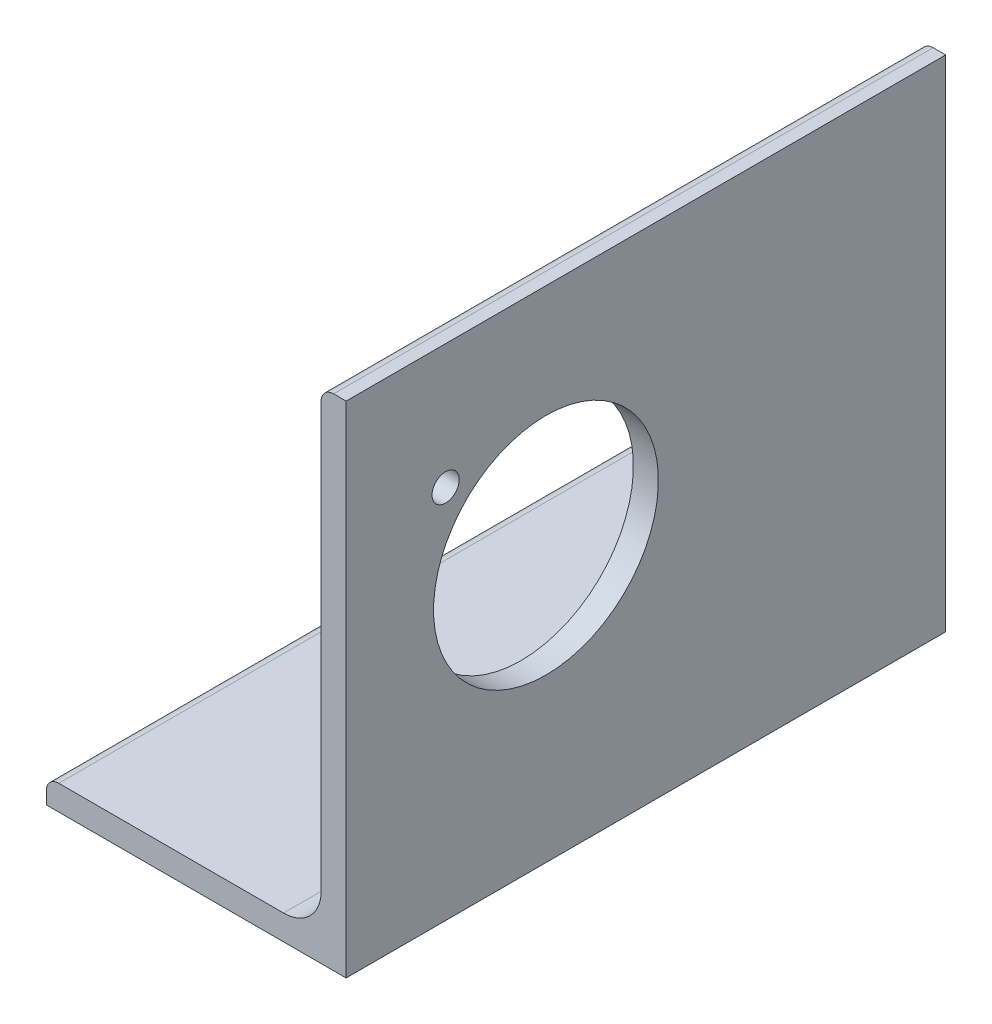
ISO-10303-21;
HEADER;
FILE_DESCRIPTION(('STEP AP214'),'2;1');
FILE_NAME('part.step','',(''),(''),'','','');
FILE_SCHEMA(('AUTOMOTIVE_DESIGN { 1 0 10303 214 1 1 1 1 }'));
ENDSEC;
DATA;
#1=APPLICATION_CONTEXT('core data for automotive mechanical design processes');
#2=APPLICATION_PROTOCOL_DEFINITION('international standard','automotive_design',2000,#1);
#3=PRODUCT_CONTEXT('',#1,'mechanical');
#4=PRODUCT('Part','Part','',(#3));
#5=PRODUCT_RELATED_PRODUCT_CATEGORY('part','',(#4));
#6=PRODUCT_DEFINITION_FORMATION('','',#4);
#7=PRODUCT_DEFINITION_CONTEXT('part definition',#1,'design');
#8=PRODUCT_DEFINITION('design','',#6,#7);
#9=PRODUCT_DEFINITION_SHAPE('','',#8);
#10=(LENGTH_UNIT() NAMED_UNIT(*) SI_UNIT(.MILLI.,.METRE.));
#11=(NAMED_UNIT(*) PLANE_ANGLE_UNIT() SI_UNIT($,.RADIAN.));
#12=(NAMED_UNIT(*) SI_UNIT($,.STERADIAN.) SOLID_ANGLE_UNIT());
#13=UNCERTAINTY_MEASURE_WITH_UNIT(LENGTH_MEASURE(1.E-05),#10,'distance_accuracy_value','');
#14=(GEOMETRIC_REPRESENTATION_CONTEXT(3) GLOBAL_UNCERTAINTY_ASSIGNED_CONTEXT((#13)) GLOBAL_UNIT_ASSIGNED_CONTEXT((#10,
#11,#12)) REPRESENTATION_CONTEXT('',''));
#15=CARTESIAN_POINT('',(0.,0.,0.));
#16=DIRECTION('',(0.,0.,1.));
#17=DIRECTION('',(1.,0.,0.));
#18=AXIS2_PLACEMENT_3D('',#15,#16,#17);
#19=CARTESIAN_POINT('',(-19.05,-30.1625,38.1));
#20=DIRECTION('',(1.,0.,0.));
#21=DIRECTION('',(0.,0.,-1.));
#22=AXIS2_PLACEMENT_3D('',#19,#20,#21);
#23=PLANE('',#22);
#24=DIRECTION('',(0.,-1.,0.));
#25=VECTOR('',#24,1.);
#26=CARTESIAN_POINT('',(-19.05,-30.1625,-38.1));
#27=LINE('',#26,#25);
#28=CARTESIAN_POINT('',(-19.05,-30.1625,-38.1));
#29=VERTEX_POINT('',#28);
#30=CARTESIAN_POINT('',(-19.05,-31.75,-38.1));
#31=VERTEX_POINT('',#30);
#32=EDGE_CURVE('E147',#29,#31,#27,.T.);
#33=ORIENTED_EDGE('',*,*,#32,.T.);
#34=DIRECTION('',(0.,0.,-1.));
#35=VECTOR('',#34,1.);
#36=CARTESIAN_POINT('',(-19.05,-31.75,38.1));
#37=LINE('',#36,#35);
#38=CARTESIAN_POINT('',(-19.05,-31.75,38.1));
#39=VERTEX_POINT('',#38);
#40=EDGE_CURVE('E11',#39,#31,#37,.T.);
#41=ORIENTED_EDGE('',*,*,#40,.F.);
#42=DIRECTION('',(0.,-1.,0.));
#43=VECTOR('',#42,1.);
#44=CARTESIAN_POINT('',(-19.05,-30.1625,38.1));
#45=LINE('',#44,#43);
#46=CARTESIAN_POINT('',(-19.05,-30.1625,38.1));
#47=VERTEX_POINT('',#46);
#48=EDGE_CURVE('E164',#47,#39,#45,.T.);
#49=ORIENTED_EDGE('',*,*,#48,.F.);
#50=DIRECTION('',(0.,0.,-1.));
#51=VECTOR('',#50,1.);
#52=CARTESIAN_POINT('',(-19.05,-30.1625,38.1));
#53=LINE('',#52,#51);
#54=EDGE_CURVE('E143',#47,#29,#53,.T.);
#55=ORIENTED_EDGE('',*,*,#54,.T.);
#56=EDGE_LOOP('',(#33,#41,#49,#55));
#57=FACE_BOUND('',#56,.T.);
#58=ADVANCED_FACE('F43',(#57),#23,.F.);
#59=CARTESIAN_POINT('',(-19.05,-31.75,38.1));
#60=DIRECTION('',(0.,1.,0.));
#61=DIRECTION('',(-1.,0.,0.));
#62=AXIS2_PLACEMENT_3D('',#59,#60,#61);
#63=PLANE('',#62);
#64=CARTESIAN_POINT('',(0.,-31.75,0.));
#65=DIRECTION('',(0.,-1.,0.));
#66=DIRECTION('',(1.,0.,0.));
#67=AXIS2_PLACEMENT_3D('',#64,#65,#66);
#68=CIRCLE('',#67,2.4892);
#69=CARTESIAN_POINT('',(2.4892,-31.75,0.));
#70=VERTEX_POINT('',#69);
#71=EDGE_CURVE('E180',#70,#70,#68,.T.);
#72=ORIENTED_EDGE('',*,*,#71,.F.);
#73=EDGE_LOOP('',(#72));
#74=FACE_BOUND('',#73,.T.);
#75=CARTESIAN_POINT('',(0.,-31.75,-25.4));
#76=DIRECTION('',(0.,-1.,0.));
#77=DIRECTION('',(1.,0.,0.));
#78=AXIS2_PLACEMENT_3D('',#75,#76,#77);
#79=CIRCLE('',#78,2.4892);
#80=CARTESIAN_POINT('',(2.4892,-31.75,-25.4));
#81=VERTEX_POINT('',#80);
#82=EDGE_CURVE('E186',#81,#81,#79,.T.);
#83=ORIENTED_EDGE('',*,*,#82,.F.);
#84=EDGE_LOOP('',(#83));
#85=FACE_BOUND('',#84,.T.);
#86=DIRECTION('',(1.,0.,0.));
#87=VECTOR('',#86,1.);
#88=CARTESIAN_POINT('',(-19.05,-31.75,-38.1));
#89=LINE('',#88,#87);
#90=CARTESIAN_POINT('',(19.05,-31.75,-38.1));
#91=VERTEX_POINT('',#90);
#92=EDGE_CURVE('E150',#31,#91,#89,.T.);
#93=ORIENTED_EDGE('',*,*,#92,.T.);
#94=DIRECTION('',(0.,0.,-1.));
#95=VECTOR('',#94,1.);
#96=CARTESIAN_POINT('',(19.05,-31.75,38.1));
#97=LINE('',#96,#95);
#98=CARTESIAN_POINT('',(19.05,-31.75,38.1));
#99=VERTEX_POINT('',#98);
#100=EDGE_CURVE('E52',#99,#91,#97,.T.);
#101=ORIENTED_EDGE('',*,*,#100,.F.);
#102=DIRECTION('',(1.,0.,0.));
#103=VECTOR('',#102,1.);
#104=CARTESIAN_POINT('',(-19.05,-31.75,38.1));
#105=LINE('',#104,#103);
#106=EDGE_CURVE('E107',#39,#99,#105,.T.);
#107=ORIENTED_EDGE('',*,*,#106,.F.);
#108=ORIENTED_EDGE('',*,*,#40,.T.);
#109=EDGE_LOOP('',(#93,#101,#107,#108));
#110=FACE_BOUND('',#109,.T.);
#111=ADVANCED_FACE('F239',(#74,#85,#110),#63,.F.);
#112=CARTESIAN_POINT('',(19.05,-31.75,38.1));
#113=DIRECTION('',(-1.,0.,0.));
#114=DIRECTION('',(0.,-1.,0.));
#115=AXIS2_PLACEMENT_3D('',#112,#113,#114);
#116=PLANE('',#115);
#117=CARTESIAN_POINT('',(19.05,15.9317261919403,25.4519637415276));
#118=DIRECTION('',(-1.,0.,0.));
#119=DIRECTION('',(0.,-1.,0.));
#120=AXIS2_PLACEMENT_3D('',#117,#118,#119);
#121=CIRCLE('',#120,1.7272);
#122=CARTESIAN_POINT('',(19.05,14.2045261919403,25.4519637415276));
#123=VERTEX_POINT('',#122);
#124=EDGE_CURVE('E184',#123,#123,#121,.T.);
#125=ORIENTED_EDGE('',*,*,#124,.T.);
#126=EDGE_LOOP('',(#125));
#127=FACE_BOUND('',#126,.T.);
#128=CARTESIAN_POINT('',(19.05,3.17976250002207,12.7000000496094));
#129=DIRECTION('',(-1.,0.,0.));
#130=DIRECTION('',(0.,-1.,0.));
#131=AXIS2_PLACEMENT_3D('',#128,#129,#130);
#132=CIRCLE('',#131,14.2875);
#133=CARTESIAN_POINT('',(19.05,-11.1077374999779,12.7000000496094));
#134=VERTEX_POINT('',#133);
#135=EDGE_CURVE('E151',#134,#134,#132,.T.);
#136=ORIENTED_EDGE('',*,*,#135,.T.);
#137=EDGE_LOOP('',(#136));
#138=FACE_BOUND('',#137,.T.);
#139=DIRECTION('',(0.,1.,0.));
#140=VECTOR('',#139,1.);
#141=CARTESIAN_POINT('',(19.05,-31.75,-38.1));
#142=LINE('',#141,#140);
#143=CARTESIAN_POINT('',(19.05,31.75,-38.1));
#144=VERTEX_POINT('',#143);
#145=EDGE_CURVE('E153',#91,#144,#142,.T.);
#146=ORIENTED_EDGE('',*,*,#145,.T.);
#147=DIRECTION('',(0.,0.,-1.));
#148=VECTOR('',#147,1.);
#149=CARTESIAN_POINT('',(19.05,31.75,38.1));
#150=LINE('',#149,#148);
#151=CARTESIAN_POINT('',(19.05,31.75,38.1));
#152=VERTEX_POINT('',#151);
#153=EDGE_CURVE('E174',#152,#144,#150,.T.);
#154=ORIENTED_EDGE('',*,*,#153,.F.);
#155=DIRECTION('',(0.,1.,0.));
#156=VECTOR('',#155,1.);
#157=CARTESIAN_POINT('',(19.05,-31.75,38.1));
#158=LINE('',#157,#156);
#159=EDGE_CURVE('E205',#99,#152,#158,.T.);
#160=ORIENTED_EDGE('',*,*,#159,.F.);
#161=ORIENTED_EDGE('',*,*,#100,.T.);
#162=EDGE_LOOP('',(#146,#154,#160,#161));
#163=FACE_BOUND('',#162,.T.);
#164=ADVANCED_FACE('F243',(#127,#138,#163),#116,.F.);
#165=CARTESIAN_POINT('',(17.4625,31.75,38.1));
#166=DIRECTION('',(0.,-1.,0.));
#167=DIRECTION('',(1.,0.,0.));
#168=AXIS2_PLACEMENT_3D('',#165,#166,#167);
#169=PLANE('',#168);
#170=DIRECTION('',(-1.,0.,0.));
#171=VECTOR('',#170,1.);
#172=CARTESIAN_POINT('',(17.4625,31.75,-38.1));
#173=LINE('',#172,#171);
#174=CARTESIAN_POINT('',(17.4625,31.75,-38.1));
#175=VERTEX_POINT('',#174);
#176=EDGE_CURVE('E155',#144,#175,#173,.T.);
#177=ORIENTED_EDGE('',*,*,#176,.T.);
#178=DIRECTION('',(0.,0.,-1.));
#179=VECTOR('',#178,1.);
#180=CARTESIAN_POINT('',(17.4625,31.75,38.1));
#181=LINE('',#180,#179);
#182=CARTESIAN_POINT('',(17.4625,31.75,38.1));
#183=VERTEX_POINT('',#182);
#184=EDGE_CURVE('E171',#183,#175,#181,.T.);
#185=ORIENTED_EDGE('',*,*,#184,.F.);
#186=DIRECTION('',(-1.,0.,0.));
#187=VECTOR('',#186,1.);
#188=CARTESIAN_POINT('',(17.4625,31.75,38.1));
#189=LINE('',#188,#187);
#190=EDGE_CURVE('E207',#152,#183,#189,.T.);
#191=ORIENTED_EDGE('',*,*,#190,.F.);
#192=ORIENTED_EDGE('',*,*,#153,.T.);
#193=EDGE_LOOP('',(#177,#185,#191,#192));
#194=FACE_BOUND('',#193,.T.);
#195=ADVANCED_FACE('F248',(#194),#169,.F.);
#196=CARTESIAN_POINT('',(17.4625,30.1625,38.1));
#197=DIRECTION('',(0.,0.,-1.));
#198=DIRECTION('',(-1.,0.,0.));
#199=AXIS2_PLACEMENT_3D('',#196,#197,#198);
#200=CYLINDRICAL_SURFACE('',#199,1.5875);
#201=CARTESIAN_POINT('',(17.4625,30.1625,-38.1));
#202=DIRECTION('',(0.,0.,1.));
#203=DIRECTION('',(-1.,0.,0.));
#204=AXIS2_PLACEMENT_3D('',#201,#202,#203);
#205=CIRCLE('',#204,1.5875);
#206=CARTESIAN_POINT('',(15.875,30.1625,-38.1));
#207=VERTEX_POINT('',#206);
#208=EDGE_CURVE('E157',#175,#207,#205,.T.);
#209=ORIENTED_EDGE('',*,*,#208,.T.);
#210=DIRECTION('',(0.,0.,-1.));
#211=VECTOR('',#210,1.);
#212=CARTESIAN_POINT('',(15.875,30.1625,38.1));
#213=LINE('',#212,#211);
#214=CARTESIAN_POINT('',(15.875,30.1625,38.1));
#215=VERTEX_POINT('',#214);
#216=EDGE_CURVE('E168',#215,#207,#213,.T.);
#217=ORIENTED_EDGE('',*,*,#216,.F.);
#218=CARTESIAN_POINT('',(17.4625,30.1625,38.1));
#219=DIRECTION('',(0.,0.,1.));
#220=DIRECTION('',(-1.,0.,0.));
#221=AXIS2_PLACEMENT_3D('',#218,#219,#220);
#222=CIRCLE('',#221,1.5875);
#223=EDGE_CURVE('E209',#183,#215,#222,.T.);
#224=ORIENTED_EDGE('',*,*,#223,.F.);
#225=ORIENTED_EDGE('',*,*,#184,.T.);
#226=EDGE_LOOP('',(#209,#217,#224,#225));
#227=FACE_BOUND('',#226,.T.);
#228=ADVANCED_FACE('F215',(#227),#200,.T.);
#229=CARTESIAN_POINT('',(15.875,30.1625,38.1));
#230=DIRECTION('',(1.,0.,0.));
#231=DIRECTION('',(0.,1.,0.));
#232=AXIS2_PLACEMENT_3D('',#229,#230,#231);
#233=PLANE('',#232);
#234=CARTESIAN_POINT('',(15.875,15.9317261919403,25.4519637415276));
#235=DIRECTION('',(-1.,0.,0.));
#236=DIRECTION('',(0.,-1.,0.));
#237=AXIS2_PLACEMENT_3D('',#234,#235,#236);
#238=CIRCLE('',#237,1.7272);
#239=CARTESIAN_POINT('',(15.875,14.2045261919403,25.4519637415276));
#240=VERTEX_POINT('',#239);
#241=EDGE_CURVE('E193',#240,#240,#238,.T.);
#242=ORIENTED_EDGE('',*,*,#241,.F.);
#243=EDGE_LOOP('',(#242));
#244=FACE_BOUND('',#243,.T.);
#245=CARTESIAN_POINT('',(15.875,3.17976250002207,12.7000000496094));
#246=DIRECTION('',(-1.,0.,0.));
#247=DIRECTION('',(0.,-1.,0.));
#248=AXIS2_PLACEMENT_3D('',#245,#246,#247);
#249=CIRCLE('',#248,14.2875);
#250=CARTESIAN_POINT('',(15.875,-11.1077374999779,12.7000000496094));
#251=VERTEX_POINT('',#250);
#252=EDGE_CURVE('E196',#251,#251,#249,.T.);
#253=ORIENTED_EDGE('',*,*,#252,.F.);
#254=EDGE_LOOP('',(#253));
#255=FACE_BOUND('',#254,.T.);
#256=DIRECTION('',(0.,-1.,0.));
#257=VECTOR('',#256,1.);
#258=CARTESIAN_POINT('',(15.875,30.1625,-38.1));
#259=LINE('',#258,#257);
#260=CARTESIAN_POINT('',(15.875,-23.7998,-38.1));
#261=VERTEX_POINT('',#260);
#262=EDGE_CURVE('E159',#207,#261,#259,.T.);
#263=ORIENTED_EDGE('',*,*,#262,.T.);
#264=DIRECTION('',(0.,0.,-1.));
#265=VECTOR('',#264,1.);
#266=CARTESIAN_POINT('',(15.875,-23.7998,38.1));
#267=LINE('',#266,#265);
#268=CARTESIAN_POINT('',(15.875,-23.7998,38.1));
#269=VERTEX_POINT('',#268);
#270=EDGE_CURVE('E138',#269,#261,#267,.T.);
#271=ORIENTED_EDGE('',*,*,#270,.F.);
#272=DIRECTION('',(0.,-1.,0.));
#273=VECTOR('',#272,1.);
#274=CARTESIAN_POINT('',(15.875,30.1625,38.1));
#275=LINE('',#274,#273);
#276=EDGE_CURVE('E129',#215,#269,#275,.T.);
#277=ORIENTED_EDGE('',*,*,#276,.F.);
#278=ORIENTED_EDGE('',*,*,#216,.T.);
#279=EDGE_LOOP('',(#263,#271,#277,#278));
#280=FACE_BOUND('',#279,.T.);
#281=ADVANCED_FACE('F219',(#244,#255,#280),#233,.F.);
#282=CARTESIAN_POINT('',(11.0998,-23.7998,38.1));
#283=DIRECTION('',(0.,0.,-1.));
#284=DIRECTION('',(-1.,0.,0.));
#285=AXIS2_PLACEMENT_3D('',#282,#283,#284);
#286=CYLINDRICAL_SURFACE('',#285,4.7752);
#287=CARTESIAN_POINT('',(11.0998,-23.7998,-38.1));
#288=DIRECTION('',(0.,0.,-1.));
#289=DIRECTION('',(-1.,0.,0.));
#290=AXIS2_PLACEMENT_3D('',#287,#288,#289);
#291=CIRCLE('',#290,4.7752);
#292=CARTESIAN_POINT('',(11.0998,-28.575,-38.1));
#293=VERTEX_POINT('',#292);
#294=EDGE_CURVE('E137',#261,#293,#291,.T.);
#295=ORIENTED_EDGE('',*,*,#294,.T.);
#296=DIRECTION('',(0.,0.,-1.));
#297=VECTOR('',#296,1.);
#298=CARTESIAN_POINT('',(11.0998,-28.575,38.1));
#299=LINE('',#298,#297);
#300=CARTESIAN_POINT('',(11.0998,-28.575,38.1));
#301=VERTEX_POINT('',#300);
#302=EDGE_CURVE('E134',#301,#293,#299,.T.);
#303=ORIENTED_EDGE('',*,*,#302,.F.);
#304=CARTESIAN_POINT('',(11.0998,-23.7998,38.1));
#305=DIRECTION('',(0.,0.,-1.));
#306=DIRECTION('',(-1.,0.,0.));
#307=AXIS2_PLACEMENT_3D('',#304,#305,#306);
#308=CIRCLE('',#307,4.7752);
#309=EDGE_CURVE('E123',#269,#301,#308,.T.);
#310=ORIENTED_EDGE('',*,*,#309,.F.);
#311=ORIENTED_EDGE('',*,*,#270,.T.);
#312=EDGE_LOOP('',(#295,#303,#310,#311));
#313=FACE_BOUND('',#312,.T.);
#314=ADVANCED_FACE('F135',(#313),#286,.F.);
#315=CARTESIAN_POINT('',(11.0998,-28.575,38.1));
#316=DIRECTION('',(0.,-1.,0.));
#317=DIRECTION('',(1.,0.,0.));
#318=AXIS2_PLACEMENT_3D('',#315,#316,#317);
#319=PLANE('',#318);
#320=CARTESIAN_POINT('',(0.,-28.575,0.));
#321=DIRECTION('',(0.,-1.,0.));
#322=DIRECTION('',(1.,0.,0.));
#323=AXIS2_PLACEMENT_3D('',#320,#321,#322);
#324=CIRCLE('',#323,2.4892);
#325=CARTESIAN_POINT('',(2.4892,-28.575,0.));
#326=VERTEX_POINT('',#325);
#327=EDGE_CURVE('E46',#326,#326,#324,.T.);
#328=ORIENTED_EDGE('',*,*,#327,.T.);
#329=EDGE_LOOP('',(#328));
#330=FACE_BOUND('',#329,.T.);
#331=CARTESIAN_POINT('',(0.,-28.575,-25.4));
#332=DIRECTION('',(0.,-1.,0.));
#333=DIRECTION('',(1.,0.,0.));
#334=AXIS2_PLACEMENT_3D('',#331,#332,#333);
#335=CIRCLE('',#334,2.4892);
#336=CARTESIAN_POINT('',(2.4892,-28.575,-25.4));
#337=VERTEX_POINT('',#336);
#338=EDGE_CURVE('E178',#337,#337,#335,.T.);
#339=ORIENTED_EDGE('',*,*,#338,.T.);
#340=EDGE_LOOP('',(#339));
#341=FACE_BOUND('',#340,.T.);
#342=DIRECTION('',(-1.,0.,0.));
#343=VECTOR('',#342,1.);
#344=CARTESIAN_POINT('',(11.0998,-28.575,-38.1));
#345=LINE('',#344,#343);
#346=CARTESIAN_POINT('',(-17.4625,-28.575,-38.1));
#347=VERTEX_POINT('',#346);
#348=EDGE_CURVE('E93',#293,#347,#345,.T.);
#349=ORIENTED_EDGE('',*,*,#348,.T.);
#350=DIRECTION('',(0.,0.,-1.));
#351=VECTOR('',#350,1.);
#352=CARTESIAN_POINT('',(-17.4625,-28.575,38.1));
#353=LINE('',#352,#351);
#354=CARTESIAN_POINT('',(-17.4625,-28.575,38.1));
#355=VERTEX_POINT('',#354);
#356=EDGE_CURVE('E139',#355,#347,#353,.T.);
#357=ORIENTED_EDGE('',*,*,#356,.F.);
#358=DIRECTION('',(-1.,0.,0.));
#359=VECTOR('',#358,1.);
#360=CARTESIAN_POINT('',(11.0998,-28.575,38.1));
#361=LINE('',#360,#359);
#362=EDGE_CURVE('E127',#301,#355,#361,.T.);
#363=ORIENTED_EDGE('',*,*,#362,.F.);
#364=ORIENTED_EDGE('',*,*,#302,.T.);
#365=EDGE_LOOP('',(#349,#357,#363,#364));
#366=FACE_BOUND('',#365,.T.);
#367=ADVANCED_FACE('F141',(#330,#341,#366),#319,.F.);
#368=CARTESIAN_POINT('',(-17.4625,-30.1625,38.1));
#369=DIRECTION('',(0.,0.,-1.));
#370=DIRECTION('',(-1.,0.,0.));
#371=AXIS2_PLACEMENT_3D('',#368,#369,#370);
#372=CYLINDRICAL_SURFACE('',#371,1.5875);
#373=CARTESIAN_POINT('',(-17.4625,-30.1625,-38.1));
#374=DIRECTION('',(0.,0.,1.));
#375=DIRECTION('',(-1.,0.,0.));
#376=AXIS2_PLACEMENT_3D('',#373,#374,#375);
#377=CIRCLE('',#376,1.5875);
#378=EDGE_CURVE('E99',#347,#29,#377,.T.);
#379=ORIENTED_EDGE('',*,*,#378,.T.);
#380=ORIENTED_EDGE('',*,*,#54,.F.);
#381=CARTESIAN_POINT('',(-17.4625,-30.1625,38.1));
#382=DIRECTION('',(0.,0.,1.));
#383=DIRECTION('',(-1.,0.,0.));
#384=AXIS2_PLACEMENT_3D('',#381,#382,#383);
#385=CIRCLE('',#384,1.5875);
#386=EDGE_CURVE('E61',#355,#47,#385,.T.);
#387=ORIENTED_EDGE('',*,*,#386,.F.);
#388=ORIENTED_EDGE('',*,*,#356,.T.);
#389=EDGE_LOOP('',(#379,#380,#387,#388));
#390=FACE_BOUND('',#389,.T.);
#391=ADVANCED_FACE('F227',(#390),#372,.T.);
#392=CARTESIAN_POINT('',(17.4625,30.1625,38.1));
#393=DIRECTION('',(0.,0.,-1.));
#394=DIRECTION('',(-1.,0.,0.));
#395=AXIS2_PLACEMENT_3D('',#392,#393,#394);
#396=PLANE('',#395);
#397=ORIENTED_EDGE('',*,*,#48,.T.);
#398=ORIENTED_EDGE('',*,*,#106,.T.);
#399=ORIENTED_EDGE('',*,*,#159,.T.);
#400=ORIENTED_EDGE('',*,*,#190,.T.);
#401=ORIENTED_EDGE('',*,*,#223,.T.);
#402=ORIENTED_EDGE('',*,*,#276,.T.);
#403=ORIENTED_EDGE('',*,*,#309,.T.);
#404=ORIENTED_EDGE('',*,*,#362,.T.);
#405=ORIENTED_EDGE('',*,*,#386,.T.);
#406=EDGE_LOOP('',(#397,#398,#399,#400,#401,#402,#403,#404,#405));
#407=FACE_BOUND('',#406,.T.);
#408=ADVANCED_FACE('F125',(#407),#396,.F.);
#409=CARTESIAN_POINT('',(17.4625,30.1625,-38.1));
#410=DIRECTION('',(0.,0.,-1.));
#411=DIRECTION('',(-1.,0.,0.));
#412=AXIS2_PLACEMENT_3D('',#409,#410,#411);
#413=PLANE('',#412);
#414=ORIENTED_EDGE('',*,*,#32,.F.);
#415=ORIENTED_EDGE('',*,*,#378,.F.);
#416=ORIENTED_EDGE('',*,*,#348,.F.);
#417=ORIENTED_EDGE('',*,*,#294,.F.);
#418=ORIENTED_EDGE('',*,*,#262,.F.);
#419=ORIENTED_EDGE('',*,*,#208,.F.);
#420=ORIENTED_EDGE('',*,*,#176,.F.);
#421=ORIENTED_EDGE('',*,*,#145,.F.);
#422=ORIENTED_EDGE('',*,*,#92,.F.);
#423=EDGE_LOOP('',(#414,#415,#416,#417,#418,#419,#420,#421,#422));
#424=FACE_BOUND('',#423,.T.);
#425=ADVANCED_FACE('F222',(#424),#413,.T.);
#426=CARTESIAN_POINT('',(19.05,3.17976250002207,12.7000000496094));
#427=DIRECTION('',(-1.,0.,0.));
#428=DIRECTION('',(0.,-1.,0.));
#429=AXIS2_PLACEMENT_3D('',#426,#427,#428);
#430=CYLINDRICAL_SURFACE('',#429,14.2875);
#431=ORIENTED_EDGE('',*,*,#135,.F.);
#432=EDGE_LOOP('',(#431));
#433=FACE_BOUND('',#432,.T.);
#434=ORIENTED_EDGE('',*,*,#252,.T.);
#435=EDGE_LOOP('',(#434));
#436=FACE_BOUND('',#435,.T.);
#437=ADVANCED_FACE('F309',(#433,#436),#430,.F.);
#438=CARTESIAN_POINT('',(19.05,15.9317261919403,25.4519637415276));
#439=DIRECTION('',(-1.,0.,0.));
#440=DIRECTION('',(0.,-1.,0.));
#441=AXIS2_PLACEMENT_3D('',#438,#439,#440);
#442=CYLINDRICAL_SURFACE('',#441,1.7272);
#443=ORIENTED_EDGE('',*,*,#124,.F.);
#444=EDGE_LOOP('',(#443));
#445=FACE_BOUND('',#444,.T.);
#446=ORIENTED_EDGE('',*,*,#241,.T.);
#447=EDGE_LOOP('',(#446));
#448=FACE_BOUND('',#447,.T.);
#449=ADVANCED_FACE('F287',(#445,#448),#442,.F.);
#450=CARTESIAN_POINT('',(0.,31.75,-25.4));
#451=DIRECTION('',(0.,-1.,0.));
#452=DIRECTION('',(1.,0.,0.));
#453=AXIS2_PLACEMENT_3D('',#450,#451,#452);
#454=CYLINDRICAL_SURFACE('',#453,2.4892);
#455=ORIENTED_EDGE('',*,*,#82,.T.);
#456=EDGE_LOOP('',(#455));
#457=FACE_BOUND('',#456,.T.);
#458=ORIENTED_EDGE('',*,*,#338,.F.);
#459=EDGE_LOOP('',(#458));
#460=FACE_BOUND('',#459,.T.);
#461=ADVANCED_FACE('F281',(#457,#460),#454,.F.);
#462=CARTESIAN_POINT('',(0.,31.75,0.));
#463=DIRECTION('',(0.,-1.,0.));
#464=DIRECTION('',(1.,0.,0.));
#465=AXIS2_PLACEMENT_3D('',#462,#463,#464);
#466=CYLINDRICAL_SURFACE('',#465,2.4892);
#467=ORIENTED_EDGE('',*,*,#71,.T.);
#468=EDGE_LOOP('',(#467));
#469=FACE_BOUND('',#468,.T.);
#470=ORIENTED_EDGE('',*,*,#327,.F.);
#471=EDGE_LOOP('',(#470));
#472=FACE_BOUND('',#471,.T.);
#473=ADVANCED_FACE('F286',(#469,#472),#466,.F.);
#474=CLOSED_SHELL('',(#58,#111,#164,#195,#228,#281,#314,#367,#391,#408,#425,#437,#449,#461,#473));
#475=MANIFOLD_SOLID_BREP('B2',#474);
#476=ADVANCED_BREP_SHAPE_REPRESENTATION('',(#18,#475),#14);
#477=SHAPE_DEFINITION_REPRESENTATION(#9,#476);
ENDSEC;
END-ISO-10303-21;
